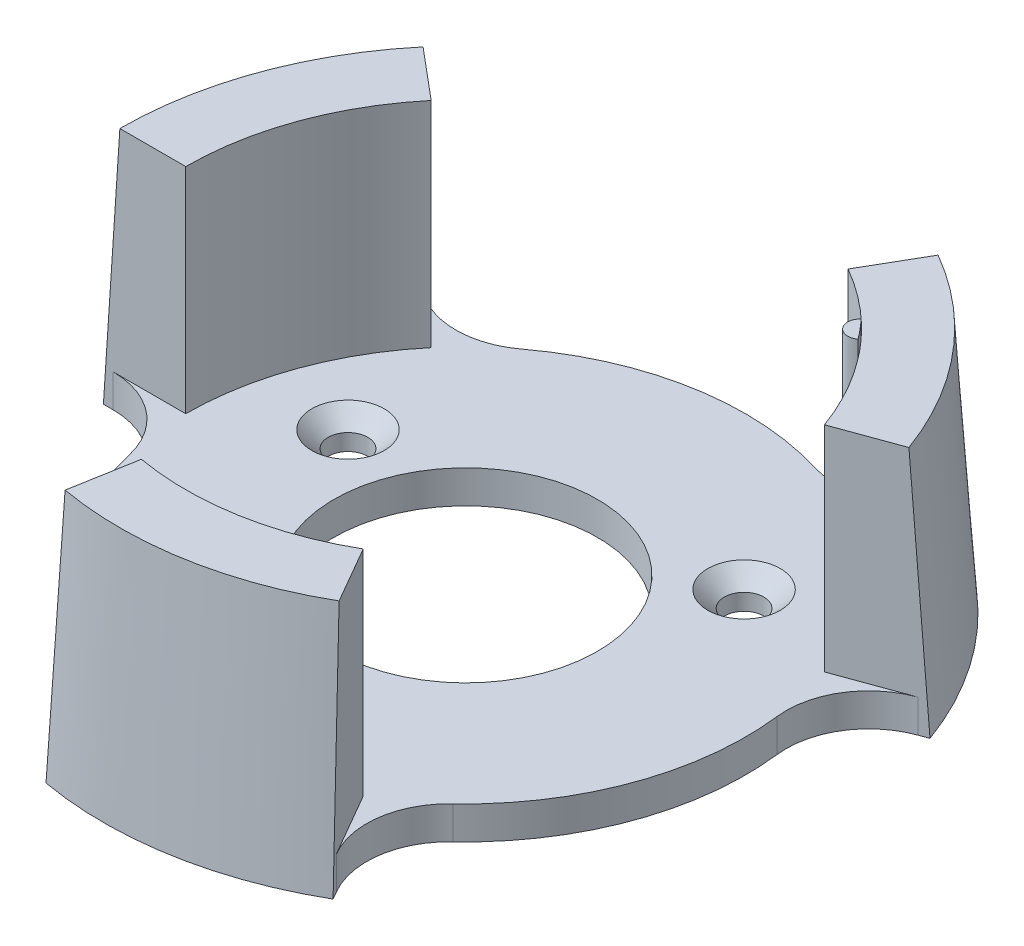
ISO-10303-21;
HEADER;
FILE_DESCRIPTION(('STEP AP214'),'2;1');
FILE_NAME('part.step','',(''),(''),'','','');
FILE_SCHEMA(('AUTOMOTIVE_DESIGN { 1 0 10303 214 1 1 1 1 }'));
ENDSEC;
DATA;
#1=APPLICATION_CONTEXT('core data for automotive mechanical design processes');
#2=APPLICATION_PROTOCOL_DEFINITION('international standard','automotive_design',2000,#1);
#3=PRODUCT_CONTEXT('',#1,'mechanical');
#4=PRODUCT('Part','Part','',(#3));
#5=PRODUCT_RELATED_PRODUCT_CATEGORY('part','',(#4));
#6=PRODUCT_DEFINITION_FORMATION('','',#4);
#7=PRODUCT_DEFINITION_CONTEXT('part definition',#1,'design');
#8=PRODUCT_DEFINITION('design','',#6,#7);
#9=PRODUCT_DEFINITION_SHAPE('','',#8);
#10=(LENGTH_UNIT() NAMED_UNIT(*) SI_UNIT(.MILLI.,.METRE.));
#11=(NAMED_UNIT(*) PLANE_ANGLE_UNIT() SI_UNIT($,.RADIAN.));
#12=(NAMED_UNIT(*) SI_UNIT($,.STERADIAN.) SOLID_ANGLE_UNIT());
#13=UNCERTAINTY_MEASURE_WITH_UNIT(LENGTH_MEASURE(1.E-05),#10,'distance_accuracy_value','');
#14=(GEOMETRIC_REPRESENTATION_CONTEXT(3) GLOBAL_UNCERTAINTY_ASSIGNED_CONTEXT((#13)) GLOBAL_UNIT_ASSIGNED_CONTEXT((#10,
#11,#12)) REPRESENTATION_CONTEXT('',''));
#15=CARTESIAN_POINT('',(0.,0.,0.));
#16=DIRECTION('',(0.,0.,1.));
#17=DIRECTION('',(1.,0.,0.));
#18=AXIS2_PLACEMENT_3D('',#15,#16,#17);
#19=CARTESIAN_POINT('',(0.,9.81368286938888,0.));
#20=DIRECTION('',(0.,1.,0.));
#21=DIRECTION('',(-0.866025403784443,0.,-0.499999999999992));
#22=AXIS2_PLACEMENT_3D('',#19,#20,#21);
#23=CYLINDRICAL_SURFACE('',#22,17.);
#24=CARTESIAN_POINT('',(0.,2.,0.));
#25=DIRECTION('',(0.,1.,0.));
#26=DIRECTION('',(0.,0.,1.));
#27=AXIS2_PLACEMENT_3D('',#24,#25,#26);
#28=CIRCLE('',#27,17.);
#29=CARTESIAN_POINT('',(8.49999999999986,2.,-14.7224318643355));
#30=VERTEX_POINT('',#29);
#31=CARTESIAN_POINT('',(12.5280977841502,2.,-11.4911603378759));
#32=VERTEX_POINT('',#31);
#33=EDGE_CURVE('E299',#30,#32,#28,.F.);
#34=ORIENTED_EDGE('',*,*,#33,.T.);
#35=DIRECTION('',(0.,-1.,0.));
#36=VECTOR('',#35,1.);
#37=CARTESIAN_POINT('',(12.5280977841502,16.,-11.4911603378759));
#38=LINE('',#37,#36);
#39=CARTESIAN_POINT('',(12.5280977841502,15.,-11.4911603378759));
#40=VERTEX_POINT('',#39);
#41=EDGE_CURVE('E237',#40,#32,#38,.T.);
#42=ORIENTED_EDGE('',*,*,#41,.F.);
#43=CARTESIAN_POINT('',(0.,15.,0.));
#44=DIRECTION('',(0.,1.,0.));
#45=DIRECTION('',(-0.866025403784443,0.,-0.499999999999992));
#46=AXIS2_PLACEMENT_3D('',#43,#44,#45);
#47=CIRCLE('',#46,17.);
#48=CARTESIAN_POINT('',(8.49999999999986,15.,-14.7224318643355));
#49=VERTEX_POINT('',#48);
#50=EDGE_CURVE('E295',#40,#49,#47,.T.);
#51=ORIENTED_EDGE('',*,*,#50,.T.);
#52=DIRECTION('',(0.,1.,0.));
#53=VECTOR('',#52,1.);
#54=CARTESIAN_POINT('',(8.49999999999986,0.,-14.7224318643355));
#55=LINE('',#54,#53);
#56=EDGE_CURVE('E268',#30,#49,#55,.T.);
#57=ORIENTED_EDGE('',*,*,#56,.F.);
#58=EDGE_LOOP('',(#34,#42,#51,#57));
#59=FACE_BOUND('',#58,.T.);
#60=ADVANCED_FACE('F38',(#59),#23,.F.);
#61=CARTESIAN_POINT('',(15.9747745533604,15.,-5.81434243653649));
#62=VERTEX_POINT('',#61);
#63=CARTESIAN_POINT('',(13.4920651416971,15.,-10.3423487763757));
#64=VERTEX_POINT('',#63);
#65=EDGE_CURVE('E296',#62,#64,#47,.T.);
#66=ORIENTED_EDGE('',*,*,#65,.T.);
#67=DIRECTION('',(0.,-1.,0.));
#68=VECTOR('',#67,1.);
#69=CARTESIAN_POINT('',(13.4920651416971,16.,-10.3423487763758));
#70=LINE('',#69,#68);
#71=CARTESIAN_POINT('',(13.4920651416971,2.,-10.3423487763758));
#72=VERTEX_POINT('',#71);
#73=EDGE_CURVE('E53',#64,#72,#70,.T.);
#74=ORIENTED_EDGE('',*,*,#73,.T.);
#75=CARTESIAN_POINT('',(15.9747745533604,2.,-5.81434243653649));
#76=VERTEX_POINT('',#75);
#77=EDGE_CURVE('E298',#72,#76,#28,.F.);
#78=ORIENTED_EDGE('',*,*,#77,.T.);
#79=DIRECTION('',(0.,1.,0.));
#80=VECTOR('',#79,1.);
#81=CARTESIAN_POINT('',(15.9747745533604,0.,-5.81434243653649));
#82=LINE('',#81,#80);
#83=EDGE_CURVE('E280',#76,#62,#82,.T.);
#84=ORIENTED_EDGE('',*,*,#83,.T.);
#85=EDGE_LOOP('',(#66,#74,#78,#84));
#86=FACE_BOUND('',#85,.T.);
#87=ADVANCED_FACE('F532',(#86),#23,.F.);
#88=CARTESIAN_POINT('',(0.,2.,0.));
#89=DIRECTION('',(0.,-1.,0.));
#90=DIRECTION('',(0.,0.,-1.));
#91=AXIS2_PLACEMENT_3D('',#88,#89,#90);
#92=CYLINDRICAL_SURFACE('',#91,17.);
#93=CARTESIAN_POINT('',(0.,2.,0.));
#94=DIRECTION('',(0.,1.,0.));
#95=DIRECTION('',(0.,0.,1.));
#96=AXIS2_PLACEMENT_3D('',#93,#94,#95);
#97=CIRCLE('',#96,17.);
#98=CARTESIAN_POINT('',(11.6235720113419,2.,12.4053445618068));
#99=VERTEX_POINT('',#98);
#100=CARTESIAN_POINT('',(16.8781745267034,2.,-2.03155719735875));
#101=VERTEX_POINT('',#100);
#102=EDGE_CURVE('E374',#99,#101,#97,.T.);
#103=ORIENTED_EDGE('',*,*,#102,.F.);
#104=DIRECTION('',(0.,-1.,0.));
#105=VECTOR('',#104,1.);
#106=CARTESIAN_POINT('',(11.6235720113419,2.,12.4053445618068));
#107=LINE('',#106,#105);
#108=CARTESIAN_POINT('',(11.6235720113419,0.,12.4053445618068));
#109=VERTEX_POINT('',#108);
#110=EDGE_CURVE('E387',#99,#109,#107,.T.);
#111=ORIENTED_EDGE('',*,*,#110,.T.);
#112=CARTESIAN_POINT('',(0.,0.,0.));
#113=DIRECTION('',(0.,1.,0.));
#114=DIRECTION('',(0.,0.,1.));
#115=AXIS2_PLACEMENT_3D('',#112,#113,#114);
#116=CIRCLE('',#115,17.);
#117=CARTESIAN_POINT('',(16.8781745267034,0.,-2.03155719735875));
#118=VERTEX_POINT('',#117);
#119=EDGE_CURVE('E379',#109,#118,#116,.T.);
#120=ORIENTED_EDGE('',*,*,#119,.T.);
#121=DIRECTION('',(0.,-1.,0.));
#122=VECTOR('',#121,1.);
#123=CARTESIAN_POINT('',(16.8781745267034,2.,-2.03155719735875));
#124=LINE('',#123,#122);
#125=EDGE_CURVE('E384',#118,#101,#124,.F.);
#126=ORIENTED_EDGE('',*,*,#125,.T.);
#127=EDGE_LOOP('',(#103,#111,#120,#126));
#128=FACE_BOUND('',#127,.T.);
#129=ADVANCED_FACE('F498',(#128),#92,.T.);
#130=CARTESIAN_POINT('',(-16.5551295388948,2.,3.86363636363636));
#131=VERTEX_POINT('',#130);
#132=CARTESIAN_POINT('',(-6.67970712119799,2.,15.6327065083119));
#133=VERTEX_POINT('',#132);
#134=EDGE_CURVE('E373',#131,#133,#97,.T.);
#135=ORIENTED_EDGE('',*,*,#134,.F.);
#136=DIRECTION('',(0.,-1.,0.));
#137=VECTOR('',#136,1.);
#138=CARTESIAN_POINT('',(-16.5551295388948,2.,3.86363636363636));
#139=LINE('',#138,#137);
#140=CARTESIAN_POINT('',(-16.5551295388948,0.,3.86363636363636));
#141=VERTEX_POINT('',#140);
#142=EDGE_CURVE('E417',#131,#141,#139,.T.);
#143=ORIENTED_EDGE('',*,*,#142,.T.);
#144=CARTESIAN_POINT('',(-6.67970712119799,0.,15.6327065083119));
#145=VERTEX_POINT('',#144);
#146=EDGE_CURVE('E375',#141,#145,#116,.T.);
#147=ORIENTED_EDGE('',*,*,#146,.T.);
#148=DIRECTION('',(0.,-1.,0.));
#149=VECTOR('',#148,1.);
#150=CARTESIAN_POINT('',(-6.67970712119799,2.,15.6327065083119));
#151=LINE('',#150,#149);
#152=EDGE_CURVE('E414',#145,#133,#151,.F.);
#153=ORIENTED_EDGE('',*,*,#152,.T.);
#154=EDGE_LOOP('',(#135,#143,#147,#153));
#155=FACE_BOUND('',#154,.T.);
#156=ADVANCED_FACE('F463',(#155),#92,.T.);
#157=CARTESIAN_POINT('',(4.93155752755282,2.,-16.2689809254433));
#158=VERTEX_POINT('',#157);
#159=CARTESIAN_POINT('',(-10.1984674055054,2.,-13.6011493109533));
#160=VERTEX_POINT('',#159);
#161=EDGE_CURVE('E378',#158,#160,#97,.T.);
#162=ORIENTED_EDGE('',*,*,#161,.F.);
#163=DIRECTION('',(0.,-1.,0.));
#164=VECTOR('',#163,1.);
#165=CARTESIAN_POINT('',(4.93155752755282,2.,-16.2689809254433));
#166=LINE('',#165,#164);
#167=CARTESIAN_POINT('',(4.93155752755282,0.,-16.2689809254433));
#168=VERTEX_POINT('',#167);
#169=EDGE_CURVE('E402',#158,#168,#166,.T.);
#170=ORIENTED_EDGE('',*,*,#169,.T.);
#171=CARTESIAN_POINT('',(-10.1984674055054,0.,-13.6011493109533));
#172=VERTEX_POINT('',#171);
#173=EDGE_CURVE('E366',#168,#172,#116,.T.);
#174=ORIENTED_EDGE('',*,*,#173,.T.);
#175=DIRECTION('',(0.,-1.,0.));
#176=VECTOR('',#175,1.);
#177=CARTESIAN_POINT('',(-10.1984674055054,2.,-13.6011493109533));
#178=LINE('',#177,#176);
#179=EDGE_CURVE('E399',#172,#160,#178,.F.);
#180=ORIENTED_EDGE('',*,*,#179,.T.);
#181=EDGE_LOOP('',(#162,#170,#174,#180));
#182=FACE_BOUND('',#181,.T.);
#183=ADVANCED_FACE('F489',(#182),#92,.T.);
#184=CARTESIAN_POINT('',(0.,2.,0.));
#185=DIRECTION('',(0.,1.,0.));
#186=DIRECTION('',(0.,0.,1.));
#187=AXIS2_PLACEMENT_3D('',#184,#185,#186);
#188=PLANE('',#187);
#189=CARTESIAN_POINT('',(2.0837781320032,2.,11.8176930361465));
#190=DIRECTION('',(0.,1.,0.));
#191=DIRECTION('',(0.,0.,1.));
#192=AXIS2_PLACEMENT_3D('',#189,#190,#191);
#193=CIRCLE('',#192,2.2);
#194=CARTESIAN_POINT('',(2.0837781320032,2.,14.0176930361465));
#195=VERTEX_POINT('',#194);
#196=EDGE_CURVE('E236',#195,#195,#193,.T.);
#197=ORIENTED_EDGE('',*,*,#196,.F.);
#198=EDGE_LOOP('',(#197));
#199=FACE_BOUND('',#198,.T.);
#200=CARTESIAN_POINT('',(9.19253331742767,2.,-7.71345131623855));
#201=DIRECTION('',(0.,1.,0.));
#202=DIRECTION('',(0.,0.,1.));
#203=AXIS2_PLACEMENT_3D('',#200,#201,#202);
#204=CIRCLE('',#203,2.2);
#205=CARTESIAN_POINT('',(9.19253331742767,2.,-5.51345131623855));
#206=VERTEX_POINT('',#205);
#207=EDGE_CURVE('E250',#206,#206,#204,.T.);
#208=ORIENTED_EDGE('',*,*,#207,.F.);
#209=EDGE_LOOP('',(#208));
#210=FACE_BOUND('',#209,.T.);
#211=CARTESIAN_POINT('',(-11.2360913429007,2.,-4.08960279831201));
#212=DIRECTION('',(0.,1.,0.));
#213=DIRECTION('',(0.,0.,1.));
#214=AXIS2_PLACEMENT_3D('',#211,#212,#213);
#215=CIRCLE('',#214,2.2);
#216=CARTESIAN_POINT('',(-11.2360913429007,2.,-1.88960279831201));
#217=VERTEX_POINT('',#216);
#218=EDGE_CURVE('E259',#217,#217,#215,.T.);
#219=ORIENTED_EDGE('',*,*,#218,.F.);
#220=EDGE_LOOP('',(#219));
#221=FACE_BOUND('',#220,.T.);
#222=ORIENTED_EDGE('',*,*,#77,.F.);
#223=CARTESIAN_POINT('',(13.0227555330225,2.,-10.9273893646713));
#224=DIRECTION('',(0.,1.,0.));
#225=DIRECTION('',(0.,0.,1.));
#226=AXIS2_PLACEMENT_3D('',#223,#224,#225);
#227=CIRCLE('',#226,0.750015998994347);
#228=EDGE_CURVE('E60',#32,#72,#227,.T.);
#229=ORIENTED_EDGE('',*,*,#228,.F.);
#230=ORIENTED_EDGE('',*,*,#33,.F.);
#231=DIRECTION('',(-0.499999999999992,0.,0.866025403784443));
#232=VECTOR('',#231,1.);
#233=CARTESIAN_POINT('',(0.,2.,0.));
#234=LINE('',#233,#232);
#235=CARTESIAN_POINT('',(10.7121426428141,2.,-18.5539753152796));
#236=VERTEX_POINT('',#235);
#237=EDGE_CURVE('E394',#236,#30,#234,.T.);
#238=ORIENTED_EDGE('',*,*,#237,.F.);
#239=CARTESIAN_POINT('',(6.38201562389189,2.,-21.0539753152795));
#240=DIRECTION('',(0.,1.,0.));
#241=DIRECTION('',(0.,0.,1.));
#242=AXIS2_PLACEMENT_3D('',#239,#240,#241);
#243=CIRCLE('',#242,5.);
#244=EDGE_CURVE('E432',#236,#158,#243,.F.);
#245=ORIENTED_EDGE('',*,*,#244,.T.);
#246=ORIENTED_EDGE('',*,*,#161,.T.);
#247=CARTESIAN_POINT('',(-13.1980166424187,2.,-17.6014873435866));
#248=DIRECTION('',(0.,1.,0.));
#249=DIRECTION('',(0.,0.,1.));
#250=AXIS2_PLACEMENT_3D('',#247,#248,#249);
#251=CIRCLE('',#250,5.);
#252=CARTESIAN_POINT('',(-16.4119546908514,2.,-13.7712651279917));
#253=VERTEX_POINT('',#252);
#254=EDGE_CURVE('E436',#160,#253,#251,.F.);
#255=ORIENTED_EDGE('',*,*,#254,.T.);
#256=DIRECTION('',(-0.766044443118977,0.,-0.642787609686541));
#257=VECTOR('',#256,1.);
#258=CARTESIAN_POINT('',(0.,2.,0.));
#259=LINE('',#258,#257);
#260=CARTESIAN_POINT('',(-13.0227555330226,2.,-10.9273893646712));
#261=VERTEX_POINT('',#260);
#262=EDGE_CURVE('E406',#261,#253,#259,.T.);
#263=ORIENTED_EDGE('',*,*,#262,.F.);
#264=CARTESIAN_POINT('',(-17.,2.,0.));
#265=VERTEX_POINT('',#264);
#266=EDGE_CURVE('E369',#261,#265,#97,.T.);
#267=ORIENTED_EDGE('',*,*,#266,.T.);
#268=DIRECTION('',(1.,0.,0.));
#269=VECTOR('',#268,1.);
#270=CARTESIAN_POINT('',(0.,2.,0.));
#271=LINE('',#270,#269);
#272=CARTESIAN_POINT('',(-21.4242852856286,2.,0.));
#273=VERTEX_POINT('',#272);
#274=EDGE_CURVE('E409',#273,#265,#271,.T.);
#275=ORIENTED_EDGE('',*,*,#274,.F.);
#276=CARTESIAN_POINT('',(-21.4242852856286,2.,5.));
#277=DIRECTION('',(0.,1.,0.));
#278=DIRECTION('',(0.,0.,1.));
#279=AXIS2_PLACEMENT_3D('',#276,#277,#278);
#280=CIRCLE('',#279,5.);
#281=EDGE_CURVE('E440',#273,#131,#280,.F.);
#282=ORIENTED_EDGE('',*,*,#281,.T.);
#283=ORIENTED_EDGE('',*,*,#134,.T.);
#284=CARTESIAN_POINT('',(-8.64432686272681,2.,20.2305613636977));
#285=DIRECTION('',(0.,1.,0.));
#286=DIRECTION('',(0.,0.,1.));
#287=AXIS2_PLACEMENT_3D('',#284,#285,#286);
#288=CIRCLE('',#287,5.);
#289=CARTESIAN_POINT('',(-3.72028809766576,2.,21.0988022520324));
#290=VERTEX_POINT('',#289);
#291=EDGE_CURVE('E46',#133,#290,#288,.F.);
#292=ORIENTED_EDGE('',*,*,#291,.T.);
#293=DIRECTION('',(-0.173648177666927,0.,0.984807753012209));
#294=VECTOR('',#293,1.);
#295=CARTESIAN_POINT('',(0.,2.,0.));
#296=LINE('',#295,#294);
#297=CARTESIAN_POINT('',(-2.95201902033776,2.,16.7417318012075));
#298=VERTEX_POINT('',#297);
#299=EDGE_CURVE('E421',#298,#290,#296,.T.);
#300=ORIENTED_EDGE('',*,*,#299,.F.);
#301=CARTESIAN_POINT('',(0.,2.,0.));
#302=DIRECTION('',(0.,1.,0.));
#303=DIRECTION('',(0.,0.,1.));
#304=AXIS2_PLACEMENT_3D('',#301,#302,#303);
#305=CIRCLE('',#304,17.);
#306=CARTESIAN_POINT('',(8.50000000000007,2.,14.7224318643354));
#307=VERTEX_POINT('',#306);
#308=EDGE_CURVE('E330',#307,#298,#305,.F.);
#309=ORIENTED_EDGE('',*,*,#308,.F.);
#310=DIRECTION('',(-0.500000000000004,0.,-0.866025403784436));
#311=VECTOR('',#310,1.);
#312=CARTESIAN_POINT('',(0.,2.,0.));
#313=LINE('',#312,#311);
#314=CARTESIAN_POINT('',(10.7121426428144,2.,18.5539753152794));
#315=VERTEX_POINT('',#314);
#316=EDGE_CURVE('E372',#315,#307,#313,.T.);
#317=ORIENTED_EDGE('',*,*,#316,.F.);
#318=CARTESIAN_POINT('',(15.0422696617365,2.,16.0539753152794));
#319=DIRECTION('',(0.,1.,0.));
#320=DIRECTION('',(0.,0.,1.));
#321=AXIS2_PLACEMENT_3D('',#318,#319,#320);
#322=CIRCLE('',#321,5.);
#323=EDGE_CURVE('E424',#315,#99,#322,.F.);
#324=ORIENTED_EDGE('',*,*,#323,.T.);
#325=ORIENTED_EDGE('',*,*,#102,.T.);
#326=CARTESIAN_POINT('',(21.8423435051456,2.,-2.62907402011132));
#327=DIRECTION('',(0.,1.,0.));
#328=DIRECTION('',(0.,0.,1.));
#329=AXIS2_PLACEMENT_3D('',#326,#327,#328);
#330=CIRCLE('',#329,5.);
#331=CARTESIAN_POINT('',(20.1322427885172,2.,-7.32753712404085));
#332=VERTEX_POINT('',#331);
#333=EDGE_CURVE('E428',#101,#332,#330,.F.);
#334=ORIENTED_EDGE('',*,*,#333,.T.);
#335=DIRECTION('',(0.939692620785906,0.,-0.342020143325676));
#336=VECTOR('',#335,1.);
#337=CARTESIAN_POINT('',(0.,2.,0.));
#338=LINE('',#337,#336);
#339=EDGE_CURVE('E391',#76,#332,#338,.T.);
#340=ORIENTED_EDGE('',*,*,#339,.F.);
#341=EDGE_LOOP('',(#222,#229,#230,#238,#245,#246,#255,#263,#267,#275,#282,#283,#292,#300,#309,
#317,#324,#325,#334,#340));
#342=FACE_BOUND('',#341,.T.);
#343=CARTESIAN_POINT('',(0.,2.,0.));
#344=DIRECTION('',(0.,1.,0.));
#345=DIRECTION('',(0.,0.,1.));
#346=AXIS2_PLACEMENT_3D('',#343,#344,#345);
#347=CIRCLE('',#346,8.);
#348=CARTESIAN_POINT('',(0.,2.,8.));
#349=VERTEX_POINT('',#348);
#350=EDGE_CURVE('E363',#349,#349,#347,.T.);
#351=ORIENTED_EDGE('',*,*,#350,.F.);
#352=EDGE_LOOP('',(#351));
#353=FACE_BOUND('',#352,.T.);
#354=ADVANCED_FACE('F444',(#199,#210,#221,#342,#353),#188,.T.);
#355=CARTESIAN_POINT('',(0.,0.,0.));
#356=DIRECTION('',(0.,1.,0.));
#357=DIRECTION('',(0.,0.,1.));
#358=AXIS2_PLACEMENT_3D('',#355,#356,#357);
#359=PLANE('',#358);
#360=CARTESIAN_POINT('',(2.0837781320032,0.,11.8176930361465));
#361=DIRECTION('',(0.,1.,0.));
#362=DIRECTION('',(0.,0.,1.));
#363=AXIS2_PLACEMENT_3D('',#360,#361,#362);
#364=CIRCLE('',#363,1.19999999999999);
#365=CARTESIAN_POINT('',(2.0837781320032,0.,13.0176930361465));
#366=VERTEX_POINT('',#365);
#367=EDGE_CURVE('E247',#366,#366,#364,.T.);
#368=ORIENTED_EDGE('',*,*,#367,.T.);
#369=EDGE_LOOP('',(#368));
#370=FACE_BOUND('',#369,.T.);
#371=CARTESIAN_POINT('',(9.19253331742767,0.,-7.71345131623855));
#372=DIRECTION('',(0.,1.,0.));
#373=DIRECTION('',(0.,0.,1.));
#374=AXIS2_PLACEMENT_3D('',#371,#372,#373);
#375=CIRCLE('',#374,1.19999999999999);
#376=CARTESIAN_POINT('',(9.19253331742767,0.,-6.51345131623857));
#377=VERTEX_POINT('',#376);
#378=EDGE_CURVE('E256',#377,#377,#375,.T.);
#379=ORIENTED_EDGE('',*,*,#378,.T.);
#380=EDGE_LOOP('',(#379));
#381=FACE_BOUND('',#380,.T.);
#382=CARTESIAN_POINT('',(-11.2360913429007,0.,-4.08960279831201));
#383=DIRECTION('',(0.,1.,0.));
#384=DIRECTION('',(0.,0.,1.));
#385=AXIS2_PLACEMENT_3D('',#382,#383,#384);
#386=CIRCLE('',#385,1.19999999999999);
#387=CARTESIAN_POINT('',(-11.2360913429007,0.,-2.88960279831202));
#388=VERTEX_POINT('',#387);
#389=EDGE_CURVE('E265',#388,#388,#386,.T.);
#390=ORIENTED_EDGE('',*,*,#389,.T.);
#391=EDGE_LOOP('',(#390));
#392=FACE_BOUND('',#391,.T.);
#393=ORIENTED_EDGE('',*,*,#146,.F.);
#394=CARTESIAN_POINT('',(-21.4242852856286,0.,5.));
#395=DIRECTION('',(0.,1.,0.));
#396=DIRECTION('',(0.,0.,1.));
#397=AXIS2_PLACEMENT_3D('',#394,#395,#396);
#398=CIRCLE('',#397,5.);
#399=CARTESIAN_POINT('',(-21.4242852856286,0.,0.));
#400=VERTEX_POINT('',#399);
#401=EDGE_CURVE('E442',#141,#400,#398,.T.);
#402=ORIENTED_EDGE('',*,*,#401,.T.);
#403=DIRECTION('',(1.,0.,0.));
#404=VECTOR('',#403,1.);
#405=CARTESIAN_POINT('',(-17.,0.,0.));
#406=LINE('',#405,#404);
#407=CARTESIAN_POINT('',(-22.,0.,0.));
#408=VERTEX_POINT('',#407);
#409=EDGE_CURVE('E341',#408,#400,#406,.T.);
#410=ORIENTED_EDGE('',*,*,#409,.F.);
#411=CARTESIAN_POINT('',(0.,0.,0.));
#412=DIRECTION('',(0.,1.,0.));
#413=DIRECTION('',(0.,0.,1.));
#414=AXIS2_PLACEMENT_3D('',#411,#412,#413);
#415=CIRCLE('',#414,22.);
#416=CARTESIAN_POINT('',(-16.8529777486175,0.,-14.1413274131039));
#417=VERTEX_POINT('',#416);
#418=EDGE_CURVE('E355',#417,#408,#415,.T.);
#419=ORIENTED_EDGE('',*,*,#418,.F.);
#420=DIRECTION('',(0.766044443118977,0.,0.64278760968654));
#421=VECTOR('',#420,1.);
#422=CARTESIAN_POINT('',(-13.0227555330226,0.,-10.9273893646712));
#423=LINE('',#422,#421);
#424=CARTESIAN_POINT('',(-16.4119546908514,0.,-13.7712651279917));
#425=VERTEX_POINT('',#424);
#426=EDGE_CURVE('E352',#417,#425,#423,.T.);
#427=ORIENTED_EDGE('',*,*,#426,.T.);
#428=CARTESIAN_POINT('',(-13.1980166424187,0.,-17.6014873435866));
#429=DIRECTION('',(0.,1.,0.));
#430=DIRECTION('',(0.,0.,1.));
#431=AXIS2_PLACEMENT_3D('',#428,#429,#430);
#432=CIRCLE('',#431,5.);
#433=EDGE_CURVE('E438',#425,#172,#432,.T.);
#434=ORIENTED_EDGE('',*,*,#433,.T.);
#435=ORIENTED_EDGE('',*,*,#173,.F.);
#436=CARTESIAN_POINT('',(6.38201562389189,0.,-21.0539753152795));
#437=DIRECTION('',(0.,1.,0.));
#438=DIRECTION('',(0.,0.,1.));
#439=AXIS2_PLACEMENT_3D('',#436,#437,#438);
#440=CIRCLE('',#439,5.);
#441=CARTESIAN_POINT('',(10.7121426428141,0.,-18.5539753152796));
#442=VERTEX_POINT('',#441);
#443=EDGE_CURVE('E434',#168,#442,#440,.T.);
#444=ORIENTED_EDGE('',*,*,#443,.T.);
#445=DIRECTION('',(-0.499999999999992,0.,0.866025403784443));
#446=VECTOR('',#445,1.);
#447=CARTESIAN_POINT('',(8.49999999999986,0.,-14.7224318643355));
#448=LINE('',#447,#446);
#449=CARTESIAN_POINT('',(10.9999999999998,0.,-19.0525588832578));
#450=VERTEX_POINT('',#449);
#451=EDGE_CURVE('E277',#450,#442,#448,.T.);
#452=ORIENTED_EDGE('',*,*,#451,.F.);
#453=CARTESIAN_POINT('',(0.,0.,0.));
#454=DIRECTION('',(0.,1.,0.));
#455=DIRECTION('',(-0.866025403784443,0.,-0.499999999999992));
#456=AXIS2_PLACEMENT_3D('',#453,#454,#455);
#457=CIRCLE('',#456,22.);
#458=CARTESIAN_POINT('',(20.6732376572899,0.,-7.52444315316487));
#459=VERTEX_POINT('',#458);
#460=EDGE_CURVE('E291',#459,#450,#457,.T.);
#461=ORIENTED_EDGE('',*,*,#460,.F.);
#462=DIRECTION('',(-0.939692620785906,0.,0.342020143325676));
#463=VECTOR('',#462,1.);
#464=CARTESIAN_POINT('',(15.9747745533604,0.,-5.81434243653649));
#465=LINE('',#464,#463);
#466=CARTESIAN_POINT('',(20.1322427885172,0.,-7.32753712404085));
#467=VERTEX_POINT('',#466);
#468=EDGE_CURVE('E288',#459,#467,#465,.T.);
#469=ORIENTED_EDGE('',*,*,#468,.T.);
#470=CARTESIAN_POINT('',(21.8423435051456,0.,-2.62907402011132));
#471=DIRECTION('',(0.,1.,0.));
#472=DIRECTION('',(0.,0.,1.));
#473=AXIS2_PLACEMENT_3D('',#470,#471,#472);
#474=CIRCLE('',#473,5.);
#475=EDGE_CURVE('E430',#467,#118,#474,.T.);
#476=ORIENTED_EDGE('',*,*,#475,.T.);
#477=ORIENTED_EDGE('',*,*,#119,.F.);
#478=CARTESIAN_POINT('',(15.0422696617365,0.,16.0539753152794));
#479=DIRECTION('',(0.,1.,0.));
#480=DIRECTION('',(0.,0.,1.));
#481=AXIS2_PLACEMENT_3D('',#478,#479,#480);
#482=CIRCLE('',#481,5.);
#483=CARTESIAN_POINT('',(10.7121426428144,0.,18.5539753152794));
#484=VERTEX_POINT('',#483);
#485=EDGE_CURVE('E426',#109,#484,#482,.T.);
#486=ORIENTED_EDGE('',*,*,#485,.T.);
#487=DIRECTION('',(-0.500000000000004,0.,-0.866025403784436));
#488=VECTOR('',#487,1.);
#489=CARTESIAN_POINT('',(8.50000000000007,0.,14.7224318643354));
#490=LINE('',#489,#488);
#491=CARTESIAN_POINT('',(11.0000000000001,0.,19.0525588832576));
#492=VERTEX_POINT('',#491);
#493=EDGE_CURVE('E309',#492,#484,#490,.T.);
#494=ORIENTED_EDGE('',*,*,#493,.F.);
#495=CARTESIAN_POINT('',(0.,0.,0.));
#496=DIRECTION('',(0.,1.,0.));
#497=DIRECTION('',(0.866025403784436,0.,-0.500000000000004));
#498=AXIS2_PLACEMENT_3D('',#495,#496,#497);
#499=CIRCLE('',#498,22.);
#500=CARTESIAN_POINT('',(-3.8202599086724,0.,21.6657705662686));
#501=VERTEX_POINT('',#500);
#502=EDGE_CURVE('E323',#501,#492,#499,.T.);
#503=ORIENTED_EDGE('',*,*,#502,.F.);
#504=DIRECTION('',(0.173648177666927,0.,-0.984807753012209));
#505=VECTOR('',#504,1.);
#506=CARTESIAN_POINT('',(-2.95201902033776,0.,16.7417318012075));
#507=LINE('',#506,#505);
#508=CARTESIAN_POINT('',(-3.72028809766576,0.,21.0988022520324));
#509=VERTEX_POINT('',#508);
#510=EDGE_CURVE('E320',#501,#509,#507,.T.);
#511=ORIENTED_EDGE('',*,*,#510,.T.);
#512=CARTESIAN_POINT('',(-8.64432686272681,0.,20.2305613636977));
#513=DIRECTION('',(0.,1.,0.));
#514=DIRECTION('',(0.,0.,1.));
#515=AXIS2_PLACEMENT_3D('',#512,#513,#514);
#516=CIRCLE('',#515,5.);
#517=EDGE_CURVE('E12',#509,#145,#516,.T.);
#518=ORIENTED_EDGE('',*,*,#517,.T.);
#519=EDGE_LOOP('',(#393,#402,#410,#419,#427,#434,#435,#444,#452,#461,#469,#476,#477,#486,#494,
#503,#511,#518));
#520=FACE_BOUND('',#519,.T.);
#521=CARTESIAN_POINT('',(0.,0.,0.));
#522=DIRECTION('',(0.,1.,0.));
#523=DIRECTION('',(0.,0.,1.));
#524=AXIS2_PLACEMENT_3D('',#521,#522,#523);
#525=CIRCLE('',#524,8.);
#526=CARTESIAN_POINT('',(0.,0.,8.));
#527=VERTEX_POINT('',#526);
#528=EDGE_CURVE('E362',#527,#527,#525,.T.);
#529=ORIENTED_EDGE('',*,*,#528,.T.);
#530=EDGE_LOOP('',(#529));
#531=FACE_BOUND('',#530,.T.);
#532=ADVANCED_FACE('F459',(#370,#381,#392,#520,#531),#359,.F.);
#533=CARTESIAN_POINT('',(0.,2.,0.));
#534=DIRECTION('',(0.,-1.,0.));
#535=DIRECTION('',(0.,0.,-1.));
#536=AXIS2_PLACEMENT_3D('',#533,#534,#535);
#537=CYLINDRICAL_SURFACE('',#536,8.);
#538=ORIENTED_EDGE('',*,*,#350,.T.);
#539=EDGE_LOOP('',(#538));
#540=FACE_BOUND('',#539,.T.);
#541=ORIENTED_EDGE('',*,*,#528,.F.);
#542=EDGE_LOOP('',(#541));
#543=FACE_BOUND('',#542,.T.);
#544=ADVANCED_FACE('F564',(#540,#543),#537,.F.);
#545=CARTESIAN_POINT('',(0.,9.81368286938888,0.));
#546=DIRECTION('',(0.,1.,0.));
#547=DIRECTION('',(0.,0.,1.));
#548=AXIS2_PLACEMENT_3D('',#545,#546,#547);
#549=CYLINDRICAL_SURFACE('',#548,17.);
#550=DIRECTION('',(0.,1.,0.));
#551=VECTOR('',#550,1.);
#552=CARTESIAN_POINT('',(-17.,0.,0.));
#553=LINE('',#552,#551);
#554=CARTESIAN_POINT('',(-17.,15.,0.));
#555=VERTEX_POINT('',#554);
#556=EDGE_CURVE('E333',#265,#555,#553,.T.);
#557=ORIENTED_EDGE('',*,*,#556,.F.);
#558=ORIENTED_EDGE('',*,*,#266,.F.);
#559=DIRECTION('',(0.,1.,0.));
#560=VECTOR('',#559,1.);
#561=CARTESIAN_POINT('',(-13.0227555330226,0.,-10.9273893646712));
#562=LINE('',#561,#560);
#563=CARTESIAN_POINT('',(-13.0227555330226,15.,-10.9273893646712));
#564=VERTEX_POINT('',#563);
#565=EDGE_CURVE('E344',#261,#564,#562,.T.);
#566=ORIENTED_EDGE('',*,*,#565,.T.);
#567=CARTESIAN_POINT('',(0.,15.,0.));
#568=DIRECTION('',(0.,1.,0.));
#569=DIRECTION('',(0.,0.,1.));
#570=AXIS2_PLACEMENT_3D('',#567,#568,#569);
#571=CIRCLE('',#570,17.);
#572=EDGE_CURVE('E359',#564,#555,#571,.T.);
#573=ORIENTED_EDGE('',*,*,#572,.T.);
#574=EDGE_LOOP('',(#557,#558,#566,#573));
#575=FACE_BOUND('',#574,.T.);
#576=ADVANCED_FACE('F560',(#575),#549,.F.);
#577=CARTESIAN_POINT('',(-13.0227555330226,15.,-10.9273893646712));
#578=DIRECTION('',(0.,1.,0.));
#579=DIRECTION('',(0.,0.,1.));
#580=AXIS2_PLACEMENT_3D('',#577,#578,#579);
#581=PLANE('',#580);
#582=CARTESIAN_POINT('',(0.,15.,0.));
#583=DIRECTION('',(0.,1.,0.));
#584=DIRECTION('',(0.,0.,1.));
#585=AXIS2_PLACEMENT_3D('',#582,#583,#584);
#586=CIRCLE('',#585,21.);
#587=CARTESIAN_POINT('',(-16.0869333054985,15.,-13.4985398034173));
#588=VERTEX_POINT('',#587);
#589=CARTESIAN_POINT('',(-21.,15.,0.));
#590=VERTEX_POINT('',#589);
#591=EDGE_CURVE('E357',#588,#590,#586,.T.);
#592=ORIENTED_EDGE('',*,*,#591,.T.);
#593=DIRECTION('',(-1.,0.,0.));
#594=VECTOR('',#593,1.);
#595=CARTESIAN_POINT('',(-17.,15.,0.));
#596=LINE('',#595,#594);
#597=EDGE_CURVE('E335',#555,#590,#596,.T.);
#598=ORIENTED_EDGE('',*,*,#597,.F.);
#599=ORIENTED_EDGE('',*,*,#572,.F.);
#600=DIRECTION('',(-0.766044443118977,0.,-0.64278760968654));
#601=VECTOR('',#600,1.);
#602=CARTESIAN_POINT('',(-13.0227555330226,15.,-10.9273893646712));
#603=LINE('',#602,#601);
#604=EDGE_CURVE('E346',#564,#588,#603,.T.);
#605=ORIENTED_EDGE('',*,*,#604,.T.);
#606=EDGE_LOOP('',(#592,#598,#599,#605));
#607=FACE_BOUND('',#606,.T.);
#608=ADVANCED_FACE('F563',(#607),#581,.T.);
#609=CARTESIAN_POINT('',(0.,15.,0.));
#610=DIRECTION('',(0.,-1.,0.));
#611=DIRECTION('',(0.,0.,-1.));
#612=AXIS2_PLACEMENT_3D('',#609,#610,#611);
#613=CONICAL_SURFACE('',#612,21.,0.0665681637758239);
#614=ORIENTED_EDGE('',*,*,#418,.T.);
#615=DIRECTION('',(-0.066519010523774,-0.997785157856609,0.));
#616=VECTOR('',#615,1.);
#617=CARTESIAN_POINT('',(-21.,15.,0.));
#618=LINE('',#617,#616);
#619=EDGE_CURVE('E338',#590,#408,#618,.T.);
#620=ORIENTED_EDGE('',*,*,#619,.F.);
#621=ORIENTED_EDGE('',*,*,#591,.F.);
#622=DIRECTION('',(-0.0509565183735098,-0.997785157856609,-0.0427575957732905));
#623=VECTOR('',#622,1.);
#624=CARTESIAN_POINT('',(-16.0869333054985,15.,-13.4985398034173));
#625=LINE('',#624,#623);
#626=EDGE_CURVE('E349',#588,#417,#625,.T.);
#627=ORIENTED_EDGE('',*,*,#626,.T.);
#628=EDGE_LOOP('',(#614,#620,#621,#627));
#629=FACE_BOUND('',#628,.T.);
#630=ADVANCED_FACE('F475',(#629),#613,.T.);
#631=CARTESIAN_POINT('',(0.,0.,0.));
#632=DIRECTION('',(-0.64278760968654,0.,0.766044443118977));
#633=DIRECTION('',(0.766044443118977,0.,0.64278760968654));
#634=AXIS2_PLACEMENT_3D('',#631,#632,#633);
#635=PLANE('',#634);
#636=ORIENTED_EDGE('',*,*,#565,.F.);
#637=ORIENTED_EDGE('',*,*,#262,.T.);
#638=DIRECTION('',(0.,1.,0.));
#639=VECTOR('',#638,1.);
#640=CARTESIAN_POINT('',(-16.4119546908514,0.,-13.7712651279917));
#641=LINE('',#640,#639);
#642=EDGE_CURVE('E404',#253,#425,#641,.F.);
#643=ORIENTED_EDGE('',*,*,#642,.T.);
#644=ORIENTED_EDGE('',*,*,#426,.F.);
#645=ORIENTED_EDGE('',*,*,#626,.F.);
#646=ORIENTED_EDGE('',*,*,#604,.F.);
#647=EDGE_LOOP('',(#636,#637,#643,#644,#645,#646));
#648=FACE_BOUND('',#647,.T.);
#649=ADVANCED_FACE('F527',(#648),#635,.F.);
#650=CARTESIAN_POINT('',(0.,0.,0.));
#651=DIRECTION('',(0.,0.,1.));
#652=DIRECTION('',(1.,0.,0.));
#653=AXIS2_PLACEMENT_3D('',#650,#651,#652);
#654=PLANE('',#653);
#655=ORIENTED_EDGE('',*,*,#409,.T.);
#656=DIRECTION('',(0.,-1.,0.));
#657=VECTOR('',#656,1.);
#658=CARTESIAN_POINT('',(-21.4242852856286,0.,0.));
#659=LINE('',#658,#657);
#660=EDGE_CURVE('E411',#400,#273,#659,.F.);
#661=ORIENTED_EDGE('',*,*,#660,.T.);
#662=ORIENTED_EDGE('',*,*,#274,.T.);
#663=ORIENTED_EDGE('',*,*,#556,.T.);
#664=ORIENTED_EDGE('',*,*,#597,.T.);
#665=ORIENTED_EDGE('',*,*,#619,.T.);
#666=EDGE_LOOP('',(#655,#661,#662,#663,#664,#665));
#667=FACE_BOUND('',#666,.T.);
#668=ADVANCED_FACE('F471',(#667),#654,.T.);
#669=CARTESIAN_POINT('',(0.,9.81368286938888,0.));
#670=DIRECTION('',(0.,1.,0.));
#671=DIRECTION('',(0.866025403784436,0.,-0.500000000000004));
#672=AXIS2_PLACEMENT_3D('',#669,#670,#671);
#673=CYLINDRICAL_SURFACE('',#672,17.);
#674=DIRECTION('',(0.,1.,0.));
#675=VECTOR('',#674,1.);
#676=CARTESIAN_POINT('',(8.50000000000007,0.,14.7224318643354));
#677=LINE('',#676,#675);
#678=CARTESIAN_POINT('',(8.50000000000007,15.,14.7224318643354));
#679=VERTEX_POINT('',#678);
#680=EDGE_CURVE('E301',#307,#679,#677,.T.);
#681=ORIENTED_EDGE('',*,*,#680,.F.);
#682=ORIENTED_EDGE('',*,*,#308,.T.);
#683=DIRECTION('',(0.,1.,0.));
#684=VECTOR('',#683,1.);
#685=CARTESIAN_POINT('',(-2.95201902033776,0.,16.7417318012075));
#686=LINE('',#685,#684);
#687=CARTESIAN_POINT('',(-2.95201902033776,15.,16.7417318012075));
#688=VERTEX_POINT('',#687);
#689=EDGE_CURVE('E312',#298,#688,#686,.T.);
#690=ORIENTED_EDGE('',*,*,#689,.T.);
#691=CARTESIAN_POINT('',(0.,15.,0.));
#692=DIRECTION('',(0.,1.,0.));
#693=DIRECTION('',(0.866025403784436,0.,-0.500000000000004));
#694=AXIS2_PLACEMENT_3D('',#691,#692,#693);
#695=CIRCLE('',#694,17.);
#696=EDGE_CURVE('E327',#688,#679,#695,.T.);
#697=ORIENTED_EDGE('',*,*,#696,.T.);
#698=EDGE_LOOP('',(#681,#682,#690,#697));
#699=FACE_BOUND('',#698,.T.);
#700=ADVANCED_FACE('F519',(#699),#673,.F.);
#701=CARTESIAN_POINT('',(-2.95201902033776,15.,16.7417318012075));
#702=DIRECTION('',(0.,1.,0.));
#703=DIRECTION('',(0.866025403784436,0.,-0.500000000000004));
#704=AXIS2_PLACEMENT_3D('',#701,#702,#703);
#705=PLANE('',#704);
#706=CARTESIAN_POINT('',(0.,15.,0.));
#707=DIRECTION('',(0.,1.,0.));
#708=DIRECTION('',(0.866025403784436,0.,-0.500000000000004));
#709=AXIS2_PLACEMENT_3D('',#706,#707,#708);
#710=CIRCLE('',#709,21.);
#711=CARTESIAN_POINT('',(-3.64661173100547,15.,20.6809628132564));
#712=VERTEX_POINT('',#711);
#713=CARTESIAN_POINT('',(10.5000000000001,15.,18.1865334794732));
#714=VERTEX_POINT('',#713);
#715=EDGE_CURVE('E325',#712,#714,#710,.T.);
#716=ORIENTED_EDGE('',*,*,#715,.T.);
#717=DIRECTION('',(0.500000000000004,0.,0.866025403784436));
#718=VECTOR('',#717,1.);
#719=CARTESIAN_POINT('',(8.50000000000007,15.,14.7224318643354));
#720=LINE('',#719,#718);
#721=EDGE_CURVE('E303',#679,#714,#720,.T.);
#722=ORIENTED_EDGE('',*,*,#721,.F.);
#723=ORIENTED_EDGE('',*,*,#696,.F.);
#724=DIRECTION('',(-0.173648177666927,0.,0.984807753012209));
#725=VECTOR('',#724,1.);
#726=CARTESIAN_POINT('',(-2.95201902033776,15.,16.7417318012075));
#727=LINE('',#726,#725);
#728=EDGE_CURVE('E314',#688,#712,#727,.T.);
#729=ORIENTED_EDGE('',*,*,#728,.T.);
#730=EDGE_LOOP('',(#716,#722,#723,#729));
#731=FACE_BOUND('',#730,.T.);
#732=ADVANCED_FACE('F516',(#731),#705,.T.);
#733=CARTESIAN_POINT('',(0.,15.,0.));
#734=DIRECTION('',(0.,-1.,0.));
#735=DIRECTION('',(-0.866025403784436,0.,0.500000000000004));
#736=AXIS2_PLACEMENT_3D('',#733,#734,#735);
#737=CONICAL_SURFACE('',#736,21.,0.0665681637758239);
#738=ORIENTED_EDGE('',*,*,#502,.T.);
#739=DIRECTION('',(0.0332595052618873,-0.997785157856609,0.0576071529481925));
#740=VECTOR('',#739,1.);
#741=CARTESIAN_POINT('',(10.5000000000001,15.,18.1865334794732));
#742=LINE('',#741,#740);
#743=EDGE_CURVE('E306',#714,#492,#742,.T.);
#744=ORIENTED_EDGE('',*,*,#743,.F.);
#745=ORIENTED_EDGE('',*,*,#715,.F.);
#746=DIRECTION('',(-0.0115509049576605,-0.997785157856609,0.0655084372865133));
#747=VECTOR('',#746,1.);
#748=CARTESIAN_POINT('',(-3.64661173100547,15.,20.6809628132564));
#749=LINE('',#748,#747);
#750=EDGE_CURVE('E317',#712,#501,#749,.T.);
#751=ORIENTED_EDGE('',*,*,#750,.T.);
#752=EDGE_LOOP('',(#738,#744,#745,#751));
#753=FACE_BOUND('',#752,.T.);
#754=ADVANCED_FACE('F512',(#753),#737,.T.);
#755=CARTESIAN_POINT('',(0.,0.,0.));
#756=DIRECTION('',(0.984807753012209,0.,0.173648177666927));
#757=DIRECTION('',(0.173648177666927,0.,-0.984807753012209));
#758=AXIS2_PLACEMENT_3D('',#755,#756,#757);
#759=PLANE('',#758);
#760=ORIENTED_EDGE('',*,*,#689,.F.);
#761=ORIENTED_EDGE('',*,*,#299,.T.);
#762=DIRECTION('',(0.,1.,0.));
#763=VECTOR('',#762,1.);
#764=CARTESIAN_POINT('',(-3.72028809766576,0.,21.0988022520324));
#765=LINE('',#764,#763);
#766=EDGE_CURVE('E419',#290,#509,#765,.F.);
#767=ORIENTED_EDGE('',*,*,#766,.T.);
#768=ORIENTED_EDGE('',*,*,#510,.F.);
#769=ORIENTED_EDGE('',*,*,#750,.F.);
#770=ORIENTED_EDGE('',*,*,#728,.F.);
#771=EDGE_LOOP('',(#760,#761,#767,#768,#769,#770));
#772=FACE_BOUND('',#771,.T.);
#773=ADVANCED_FACE('F453',(#772),#759,.F.);
#774=CARTESIAN_POINT('',(0.,0.,0.));
#775=DIRECTION('',(0.866025403784436,0.,-0.500000000000004));
#776=DIRECTION('',(-0.500000000000004,0.,-0.866025403784436));
#777=AXIS2_PLACEMENT_3D('',#774,#775,#776);
#778=PLANE('',#777);
#779=ORIENTED_EDGE('',*,*,#493,.T.);
#780=DIRECTION('',(0.,-1.,0.));
#781=VECTOR('',#780,1.);
#782=CARTESIAN_POINT('',(10.7121426428144,0.,18.5539753152794));
#783=LINE('',#782,#781);
#784=EDGE_CURVE('E381',#484,#315,#783,.F.);
#785=ORIENTED_EDGE('',*,*,#784,.T.);
#786=ORIENTED_EDGE('',*,*,#316,.T.);
#787=ORIENTED_EDGE('',*,*,#680,.T.);
#788=ORIENTED_EDGE('',*,*,#721,.T.);
#789=ORIENTED_EDGE('',*,*,#743,.T.);
#790=EDGE_LOOP('',(#779,#785,#786,#787,#788,#789));
#791=FACE_BOUND('',#790,.T.);
#792=ADVANCED_FACE('F508',(#791),#778,.T.);
#793=CARTESIAN_POINT('',(15.9747745533604,15.,-5.81434243653649));
#794=DIRECTION('',(0.,1.,0.));
#795=DIRECTION('',(-0.866025403784443,0.,-0.499999999999992));
#796=AXIS2_PLACEMENT_3D('',#793,#794,#795);
#797=PLANE('',#796);
#798=CARTESIAN_POINT('',(0.,15.,0.));
#799=DIRECTION('',(0.,1.,0.));
#800=DIRECTION('',(-0.866025403784443,0.,-0.499999999999992));
#801=AXIS2_PLACEMENT_3D('',#798,#799,#800);
#802=CIRCLE('',#801,21.);
#803=CARTESIAN_POINT('',(19.733545036504,15.,-7.1824230098392));
#804=VERTEX_POINT('',#803);
#805=CARTESIAN_POINT('',(10.4999999999998,15.,-18.1865334794733));
#806=VERTEX_POINT('',#805);
#807=EDGE_CURVE('E293',#804,#806,#802,.T.);
#808=ORIENTED_EDGE('',*,*,#807,.T.);
#809=DIRECTION('',(0.499999999999992,0.,-0.866025403784443));
#810=VECTOR('',#809,1.);
#811=CARTESIAN_POINT('',(8.49999999999986,15.,-14.7224318643355));
#812=LINE('',#811,#810);
#813=EDGE_CURVE('E271',#49,#806,#812,.T.);
#814=ORIENTED_EDGE('',*,*,#813,.F.);
#815=ORIENTED_EDGE('',*,*,#50,.F.);
#816=EDGE_CURVE('E235',#64,#40,#47,.T.);
#817=ORIENTED_EDGE('',*,*,#816,.F.);
#818=ORIENTED_EDGE('',*,*,#65,.F.);
#819=DIRECTION('',(0.939692620785906,0.,-0.342020143325676));
#820=VECTOR('',#819,1.);
#821=CARTESIAN_POINT('',(15.9747745533604,15.,-5.81434243653649));
#822=LINE('',#821,#820);
#823=EDGE_CURVE('E282',#62,#804,#822,.T.);
#824=ORIENTED_EDGE('',*,*,#823,.T.);
#825=EDGE_LOOP('',(#808,#814,#815,#817,#818,#824));
#826=FACE_BOUND('',#825,.T.);
#827=ADVANCED_FACE('F545',(#826),#797,.T.);
#828=CARTESIAN_POINT('',(0.,15.,0.));
#829=DIRECTION('',(0.,-1.,0.));
#830=DIRECTION('',(0.866025403784443,0.,0.499999999999992));
#831=AXIS2_PLACEMENT_3D('',#828,#829,#830);
#832=CONICAL_SURFACE('',#831,21.,0.0665681637758239);
#833=ORIENTED_EDGE('',*,*,#460,.T.);
#834=DIRECTION('',(0.0332595052618865,-0.997785157856609,-0.057607152948193));
#835=VECTOR('',#834,1.);
#836=CARTESIAN_POINT('',(10.4999999999998,15.,-18.1865334794733));
#837=LINE('',#836,#835);
#838=EDGE_CURVE('E274',#806,#450,#837,.T.);
#839=ORIENTED_EDGE('',*,*,#838,.F.);
#840=ORIENTED_EDGE('',*,*,#807,.F.);
#841=DIRECTION('',(0.0625074233311704,-0.997785157856609,-0.0227508415132233));
#842=VECTOR('',#841,1.);
#843=CARTESIAN_POINT('',(19.733545036504,15.,-7.1824230098392));
#844=LINE('',#843,#842);
#845=EDGE_CURVE('E285',#804,#459,#844,.T.);
#846=ORIENTED_EDGE('',*,*,#845,.T.);
#847=EDGE_LOOP('',(#833,#839,#840,#846));
#848=FACE_BOUND('',#847,.T.);
#849=ADVANCED_FACE('F542',(#848),#832,.T.);
#850=CARTESIAN_POINT('',(0.,0.,0.));
#851=DIRECTION('',(-0.342020143325676,0.,-0.939692620785906));
#852=DIRECTION('',(-0.939692620785906,0.,0.342020143325676));
#853=AXIS2_PLACEMENT_3D('',#850,#851,#852);
#854=PLANE('',#853);
#855=ORIENTED_EDGE('',*,*,#83,.F.);
#856=ORIENTED_EDGE('',*,*,#339,.T.);
#857=DIRECTION('',(0.,1.,0.));
#858=VECTOR('',#857,1.);
#859=CARTESIAN_POINT('',(20.1322427885172,0.,-7.32753712404085));
#860=LINE('',#859,#858);
#861=EDGE_CURVE('E389',#332,#467,#860,.F.);
#862=ORIENTED_EDGE('',*,*,#861,.T.);
#863=ORIENTED_EDGE('',*,*,#468,.F.);
#864=ORIENTED_EDGE('',*,*,#845,.F.);
#865=ORIENTED_EDGE('',*,*,#823,.F.);
#866=EDGE_LOOP('',(#855,#856,#862,#863,#864,#865));
#867=FACE_BOUND('',#866,.T.);
#868=ADVANCED_FACE('F540',(#867),#854,.F.);
#869=CARTESIAN_POINT('',(0.,0.,0.));
#870=DIRECTION('',(-0.866025403784443,0.,-0.499999999999992));
#871=DIRECTION('',(-0.499999999999992,0.,0.866025403784443));
#872=AXIS2_PLACEMENT_3D('',#869,#870,#871);
#873=PLANE('',#872);
#874=ORIENTED_EDGE('',*,*,#451,.T.);
#875=DIRECTION('',(0.,-1.,0.));
#876=VECTOR('',#875,1.);
#877=CARTESIAN_POINT('',(10.7121426428141,0.,-18.5539753152796));
#878=LINE('',#877,#876);
#879=EDGE_CURVE('E396',#442,#236,#878,.F.);
#880=ORIENTED_EDGE('',*,*,#879,.T.);
#881=ORIENTED_EDGE('',*,*,#237,.T.);
#882=ORIENTED_EDGE('',*,*,#56,.T.);
#883=ORIENTED_EDGE('',*,*,#813,.T.);
#884=ORIENTED_EDGE('',*,*,#838,.T.);
#885=EDGE_LOOP('',(#874,#880,#881,#882,#883,#884));
#886=FACE_BOUND('',#885,.T.);
#887=ADVANCED_FACE('F585',(#886),#873,.T.);
#888=CARTESIAN_POINT('',(15.0422696617365,2.,16.0539753152794));
#889=DIRECTION('',(0.,-1.,0.));
#890=DIRECTION('',(0.,0.,-1.));
#891=AXIS2_PLACEMENT_3D('',#888,#889,#890);
#892=CYLINDRICAL_SURFACE('',#891,5.);
#893=ORIENTED_EDGE('',*,*,#485,.F.);
#894=ORIENTED_EDGE('',*,*,#110,.F.);
#895=ORIENTED_EDGE('',*,*,#323,.F.);
#896=ORIENTED_EDGE('',*,*,#784,.F.);
#897=EDGE_LOOP('',(#893,#894,#895,#896));
#898=FACE_BOUND('',#897,.T.);
#899=ADVANCED_FACE('F504',(#898),#892,.F.);
#900=CARTESIAN_POINT('',(21.8423435051456,2.,-2.62907402011132));
#901=DIRECTION('',(0.,-1.,0.));
#902=DIRECTION('',(0.,0.,-1.));
#903=AXIS2_PLACEMENT_3D('',#900,#901,#902);
#904=CYLINDRICAL_SURFACE('',#903,5.);
#905=ORIENTED_EDGE('',*,*,#475,.F.);
#906=ORIENTED_EDGE('',*,*,#861,.F.);
#907=ORIENTED_EDGE('',*,*,#333,.F.);
#908=ORIENTED_EDGE('',*,*,#125,.F.);
#909=EDGE_LOOP('',(#905,#906,#907,#908));
#910=FACE_BOUND('',#909,.T.);
#911=ADVANCED_FACE('F584',(#910),#904,.F.);
#912=CARTESIAN_POINT('',(6.38201562389189,2.,-21.0539753152795));
#913=DIRECTION('',(0.,-1.,0.));
#914=DIRECTION('',(0.,0.,-1.));
#915=AXIS2_PLACEMENT_3D('',#912,#913,#914);
#916=CYLINDRICAL_SURFACE('',#915,5.);
#917=ORIENTED_EDGE('',*,*,#443,.F.);
#918=ORIENTED_EDGE('',*,*,#169,.F.);
#919=ORIENTED_EDGE('',*,*,#244,.F.);
#920=ORIENTED_EDGE('',*,*,#879,.F.);
#921=EDGE_LOOP('',(#917,#918,#919,#920));
#922=FACE_BOUND('',#921,.T.);
#923=ADVANCED_FACE('F588',(#922),#916,.F.);
#924=CARTESIAN_POINT('',(-13.1980166424187,2.,-17.6014873435866));
#925=DIRECTION('',(0.,-1.,0.));
#926=DIRECTION('',(0.,0.,-1.));
#927=AXIS2_PLACEMENT_3D('',#924,#925,#926);
#928=CYLINDRICAL_SURFACE('',#927,5.);
#929=ORIENTED_EDGE('',*,*,#433,.F.);
#930=ORIENTED_EDGE('',*,*,#642,.F.);
#931=ORIENTED_EDGE('',*,*,#254,.F.);
#932=ORIENTED_EDGE('',*,*,#179,.F.);
#933=EDGE_LOOP('',(#929,#930,#931,#932));
#934=FACE_BOUND('',#933,.T.);
#935=ADVANCED_FACE('F485',(#934),#928,.F.);
#936=CARTESIAN_POINT('',(-21.4242852856286,2.,5.));
#937=DIRECTION('',(0.,-1.,0.));
#938=DIRECTION('',(0.,0.,-1.));
#939=AXIS2_PLACEMENT_3D('',#936,#937,#938);
#940=CYLINDRICAL_SURFACE('',#939,5.);
#941=ORIENTED_EDGE('',*,*,#401,.F.);
#942=ORIENTED_EDGE('',*,*,#142,.F.);
#943=ORIENTED_EDGE('',*,*,#281,.F.);
#944=ORIENTED_EDGE('',*,*,#660,.F.);
#945=EDGE_LOOP('',(#941,#942,#943,#944));
#946=FACE_BOUND('',#945,.T.);
#947=ADVANCED_FACE('F466',(#946),#940,.F.);
#948=CARTESIAN_POINT('',(-8.64432686272681,2.,20.2305613636977));
#949=DIRECTION('',(0.,-1.,0.));
#950=DIRECTION('',(0.,0.,-1.));
#951=AXIS2_PLACEMENT_3D('',#948,#949,#950);
#952=CYLINDRICAL_SURFACE('',#951,5.);
#953=ORIENTED_EDGE('',*,*,#517,.F.);
#954=ORIENTED_EDGE('',*,*,#766,.F.);
#955=ORIENTED_EDGE('',*,*,#291,.F.);
#956=ORIENTED_EDGE('',*,*,#152,.F.);
#957=EDGE_LOOP('',(#953,#954,#955,#956));
#958=FACE_BOUND('',#957,.T.);
#959=ADVANCED_FACE('F40',(#958),#952,.F.);
#960=CARTESIAN_POINT('',(-11.2360913429007,2.,-4.08960279831201));
#961=DIRECTION('',(0.,1.,0.));
#962=DIRECTION('',(0.,0.,1.));
#963=AXIS2_PLACEMENT_3D('',#960,#961,#962);
#964=CYLINDRICAL_SURFACE('',#963,1.19999999999999);
#965=ORIENTED_EDGE('',*,*,#389,.F.);
#966=EDGE_LOOP('',(#965));
#967=FACE_BOUND('',#966,.T.);
#968=CARTESIAN_POINT('',(-11.2360913429007,1.,-4.08960279831201));
#969=DIRECTION('',(0.,1.,0.));
#970=DIRECTION('',(0.,0.,1.));
#971=AXIS2_PLACEMENT_3D('',#968,#969,#970);
#972=CIRCLE('',#971,1.2);
#973=CARTESIAN_POINT('',(-11.2360913429007,1.,-2.88960279831201));
#974=VERTEX_POINT('',#973);
#975=EDGE_CURVE('E262',#974,#974,#972,.T.);
#976=ORIENTED_EDGE('',*,*,#975,.T.);
#977=EDGE_LOOP('',(#976));
#978=FACE_BOUND('',#977,.T.);
#979=ADVANCED_FACE('F598',(#967,#978),#964,.F.);
#980=CARTESIAN_POINT('',(-11.2360913429007,2.,-4.08960279831201));
#981=DIRECTION('',(0.,1.,0.));
#982=DIRECTION('',(0.,0.,1.));
#983=AXIS2_PLACEMENT_3D('',#980,#981,#982);
#984=CONICAL_SURFACE('',#983,2.2,0.785398163397448);
#985=ORIENTED_EDGE('',*,*,#975,.F.);
#986=EDGE_LOOP('',(#985));
#987=FACE_BOUND('',#986,.T.);
#988=ORIENTED_EDGE('',*,*,#218,.T.);
#989=EDGE_LOOP('',(#988));
#990=FACE_BOUND('',#989,.T.);
#991=ADVANCED_FACE('F602',(#987,#990),#984,.F.);
#992=CARTESIAN_POINT('',(9.19253331742767,2.,-7.71345131623855));
#993=DIRECTION('',(0.,1.,0.));
#994=DIRECTION('',(0.,0.,1.));
#995=AXIS2_PLACEMENT_3D('',#992,#993,#994);
#996=CYLINDRICAL_SURFACE('',#995,1.19999999999999);
#997=ORIENTED_EDGE('',*,*,#378,.F.);
#998=EDGE_LOOP('',(#997));
#999=FACE_BOUND('',#998,.T.);
#1000=CARTESIAN_POINT('',(9.19253331742767,1.,-7.71345131623855));
#1001=DIRECTION('',(0.,1.,0.));
#1002=DIRECTION('',(0.,0.,1.));
#1003=AXIS2_PLACEMENT_3D('',#1000,#1001,#1002);
#1004=CIRCLE('',#1003,1.2);
#1005=CARTESIAN_POINT('',(9.19253331742767,1.,-6.51345131623855));
#1006=VERTEX_POINT('',#1005);
#1007=EDGE_CURVE('E253',#1006,#1006,#1004,.T.);
#1008=ORIENTED_EDGE('',*,*,#1007,.T.);
#1009=EDGE_LOOP('',(#1008));
#1010=FACE_BOUND('',#1009,.T.);
#1011=ADVANCED_FACE('F608',(#999,#1010),#996,.F.);
#1012=CARTESIAN_POINT('',(9.19253331742767,2.,-7.71345131623855));
#1013=DIRECTION('',(0.,1.,0.));
#1014=DIRECTION('',(0.,0.,1.));
#1015=AXIS2_PLACEMENT_3D('',#1012,#1013,#1014);
#1016=CONICAL_SURFACE('',#1015,2.2,0.785398163397448);
#1017=ORIENTED_EDGE('',*,*,#1007,.F.);
#1018=EDGE_LOOP('',(#1017));
#1019=FACE_BOUND('',#1018,.T.);
#1020=ORIENTED_EDGE('',*,*,#207,.T.);
#1021=EDGE_LOOP('',(#1020));
#1022=FACE_BOUND('',#1021,.T.);
#1023=ADVANCED_FACE('F775',(#1019,#1022),#1016,.F.);
#1024=CARTESIAN_POINT('',(2.0837781320032,2.,11.8176930361465));
#1025=DIRECTION('',(0.,1.,0.));
#1026=DIRECTION('',(0.,0.,1.));
#1027=AXIS2_PLACEMENT_3D('',#1024,#1025,#1026);
#1028=CYLINDRICAL_SURFACE('',#1027,1.19999999999999);
#1029=ORIENTED_EDGE('',*,*,#367,.F.);
#1030=EDGE_LOOP('',(#1029));
#1031=FACE_BOUND('',#1030,.T.);
#1032=CARTESIAN_POINT('',(2.0837781320032,1.,11.8176930361465));
#1033=DIRECTION('',(0.,1.,0.));
#1034=DIRECTION('',(0.,0.,1.));
#1035=AXIS2_PLACEMENT_3D('',#1032,#1033,#1034);
#1036=CIRCLE('',#1035,1.2);
#1037=CARTESIAN_POINT('',(2.0837781320032,1.,13.0176930361465));
#1038=VERTEX_POINT('',#1037);
#1039=EDGE_CURVE('E240',#1038,#1038,#1036,.T.);
#1040=ORIENTED_EDGE('',*,*,#1039,.T.);
#1041=EDGE_LOOP('',(#1040));
#1042=FACE_BOUND('',#1041,.T.);
#1043=ADVANCED_FACE('F784',(#1031,#1042),#1028,.F.);
#1044=CARTESIAN_POINT('',(2.0837781320032,2.,11.8176930361465));
#1045=DIRECTION('',(0.,1.,0.));
#1046=DIRECTION('',(0.,0.,1.));
#1047=AXIS2_PLACEMENT_3D('',#1044,#1045,#1046);
#1048=CONICAL_SURFACE('',#1047,2.2,0.785398163397448);
#1049=ORIENTED_EDGE('',*,*,#1039,.F.);
#1050=EDGE_LOOP('',(#1049));
#1051=FACE_BOUND('',#1050,.T.);
#1052=ORIENTED_EDGE('',*,*,#196,.T.);
#1053=EDGE_LOOP('',(#1052));
#1054=FACE_BOUND('',#1053,.T.);
#1055=ADVANCED_FACE('F793',(#1051,#1054),#1048,.F.);
#1056=CARTESIAN_POINT('',(0.,16.,0.));
#1057=DIRECTION('',(0.,-1.,0.));
#1058=DIRECTION('',(0.,0.,-1.));
#1059=AXIS2_PLACEMENT_3D('',#1056,#1057,#1058);
#1060=CYLINDRICAL_SURFACE('',#1059,17.);
#1061=ORIENTED_EDGE('',*,*,#816,.T.);
#1062=CARTESIAN_POINT('',(12.5280977841502,16.,-11.4911603378759));
#1063=VERTEX_POINT('',#1062);
#1064=EDGE_CURVE('E223',#1063,#40,#38,.T.);
#1065=ORIENTED_EDGE('',*,*,#1064,.F.);
#1066=CARTESIAN_POINT('',(0.,16.,0.));
#1067=DIRECTION('',(0.,1.,0.));
#1068=DIRECTION('',(0.,0.,1.));
#1069=AXIS2_PLACEMENT_3D('',#1066,#1067,#1068);
#1070=CIRCLE('',#1069,17.);
#1071=CARTESIAN_POINT('',(13.4920651416971,16.,-10.3423487763758));
#1072=VERTEX_POINT('',#1071);
#1073=EDGE_CURVE('E228',#1072,#1063,#1070,.T.);
#1074=ORIENTED_EDGE('',*,*,#1073,.F.);
#1075=EDGE_CURVE('E225',#1072,#64,#70,.T.);
#1076=ORIENTED_EDGE('',*,*,#1075,.T.);
#1077=EDGE_LOOP('',(#1061,#1065,#1074,#1076));
#1078=FACE_BOUND('',#1077,.T.);
#1079=ADVANCED_FACE('F234',(#1078),#1060,.T.);
#1080=CARTESIAN_POINT('',(13.0227555330225,16.,-10.9273893646713));
#1081=DIRECTION('',(0.,-1.,0.));
#1082=DIRECTION('',(0.,0.,-1.));
#1083=AXIS2_PLACEMENT_3D('',#1080,#1081,#1082);
#1084=CYLINDRICAL_SURFACE('',#1083,0.750015998994347);
#1085=ORIENTED_EDGE('',*,*,#228,.T.);
#1086=ORIENTED_EDGE('',*,*,#73,.F.);
#1087=ORIENTED_EDGE('',*,*,#1075,.F.);
#1088=CARTESIAN_POINT('',(13.0227555330225,16.,-10.9273893646713));
#1089=DIRECTION('',(0.,1.,0.));
#1090=DIRECTION('',(0.,0.,1.));
#1091=AXIS2_PLACEMENT_3D('',#1088,#1089,#1090);
#1092=CIRCLE('',#1091,0.750015998994347);
#1093=EDGE_CURVE('E218',#1063,#1072,#1092,.T.);
#1094=ORIENTED_EDGE('',*,*,#1093,.F.);
#1095=ORIENTED_EDGE('',*,*,#1064,.T.);
#1096=ORIENTED_EDGE('',*,*,#41,.T.);
#1097=EDGE_LOOP('',(#1085,#1086,#1087,#1094,#1095,#1096));
#1098=FACE_BOUND('',#1097,.T.);
#1099=ADVANCED_FACE('F220',(#1098),#1084,.T.);
#1100=CARTESIAN_POINT('',(6.51137776651127,16.,-5.46369468233564));
#1101=DIRECTION('',(0.,1.,0.));
#1102=DIRECTION('',(0.,0.,1.));
#1103=AXIS2_PLACEMENT_3D('',#1100,#1101,#1102);
#1104=PLANE('',#1103);
#1105=ORIENTED_EDGE('',*,*,#1073,.T.);
#1106=ORIENTED_EDGE('',*,*,#1093,.T.);
#1107=EDGE_LOOP('',(#1105,#1106));
#1108=FACE_BOUND('',#1107,.T.);
#1109=ADVANCED_FACE('F230',(#1108),#1104,.T.);
#1110=CLOSED_SHELL('',(#60,#87,#129,#156,#183,#354,#532,#544,#576,#608,#630,#649,#668,#700,#732,
#754,#773,#792,#827,#849,#868,#887,#899,#911,#923,#935,#947,#959,#979,#991,#1011,#1023,#1043,
#1055,#1079,#1099,#1109));
#1111=MANIFOLD_SOLID_BREP('B2',#1110);
#1112=ADVANCED_BREP_SHAPE_REPRESENTATION('',(#18,#1111),#14);
#1113=SHAPE_DEFINITION_REPRESENTATION(#9,#1112);
ENDSEC;
END-ISO-10303-21;
